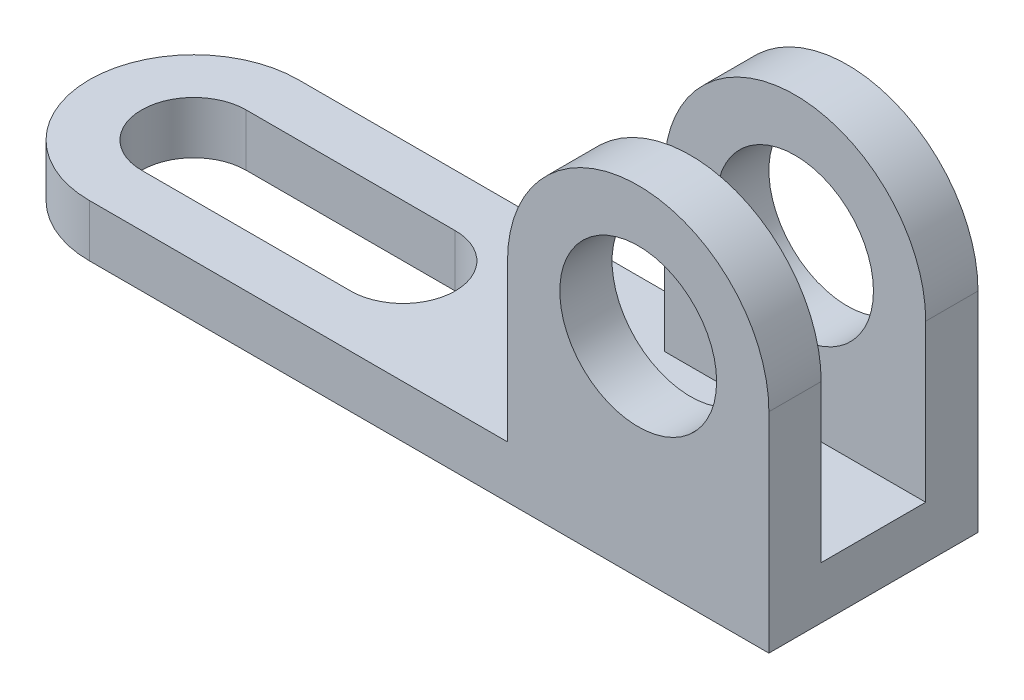
ISO-10303-21;
HEADER;
FILE_DESCRIPTION(('STEP AP214'),'2;1');
FILE_NAME('part.step','',(''),(''),'','','');
FILE_SCHEMA(('AUTOMOTIVE_DESIGN { 1 0 10303 214 1 1 1 1 }'));
ENDSEC;
DATA;
#1=APPLICATION_CONTEXT('core data for automotive mechanical design processes');
#2=APPLICATION_PROTOCOL_DEFINITION('international standard','automotive_design',2000,#1);
#3=PRODUCT_CONTEXT('',#1,'mechanical');
#4=PRODUCT('Part','Part','',(#3));
#5=PRODUCT_RELATED_PRODUCT_CATEGORY('part','',(#4));
#6=PRODUCT_DEFINITION_FORMATION('','',#4);
#7=PRODUCT_DEFINITION_CONTEXT('part definition',#1,'design');
#8=PRODUCT_DEFINITION('design','',#6,#7);
#9=PRODUCT_DEFINITION_SHAPE('','',#8);
#10=(LENGTH_UNIT() NAMED_UNIT(*) SI_UNIT(.MILLI.,.METRE.));
#11=(NAMED_UNIT(*) PLANE_ANGLE_UNIT() SI_UNIT($,.RADIAN.));
#12=(NAMED_UNIT(*) SI_UNIT($,.STERADIAN.) SOLID_ANGLE_UNIT());
#13=UNCERTAINTY_MEASURE_WITH_UNIT(LENGTH_MEASURE(1.E-05),#10,'distance_accuracy_value','');
#14=(GEOMETRIC_REPRESENTATION_CONTEXT(3) GLOBAL_UNCERTAINTY_ASSIGNED_CONTEXT((#13)) GLOBAL_UNIT_ASSIGNED_CONTEXT((#10,
#11,#12)) REPRESENTATION_CONTEXT('',''));
#15=CARTESIAN_POINT('',(0.,0.,0.));
#16=DIRECTION('',(0.,0.,1.));
#17=DIRECTION('',(1.,0.,0.));
#18=AXIS2_PLACEMENT_3D('',#15,#16,#17);
#19=CARTESIAN_POINT('',(-50.,80.,-20.));
#20=DIRECTION('',(1.,0.,0.));
#21=DIRECTION('',(0.,0.,-1.));
#22=AXIS2_PLACEMENT_3D('',#19,#20,#21);
#23=PLANE('',#22);
#24=DIRECTION('',(0.,0.,1.));
#25=VECTOR('',#24,1.);
#26=CARTESIAN_POINT('',(-50.,10.,-20.));
#27=LINE('',#26,#25);
#28=CARTESIAN_POINT('',(-50.,10.,-20.));
#29=VERTEX_POINT('',#28);
#30=CARTESIAN_POINT('',(-50.,9.99999999999999,-9.99999999999998));
#31=VERTEX_POINT('',#30);
#32=EDGE_CURVE('E222',#29,#31,#27,.T.);
#33=ORIENTED_EDGE('',*,*,#32,.T.);
#34=DIRECTION('',(0.,1.,0.));
#35=VECTOR('',#34,1.);
#36=CARTESIAN_POINT('',(-50.,80.,-9.99999999999998));
#37=LINE('',#36,#35);
#38=CARTESIAN_POINT('',(-50.,40.,-9.99999999999998));
#39=VERTEX_POINT('',#38);
#40=EDGE_CURVE('E198',#31,#39,#37,.T.);
#41=ORIENTED_EDGE('',*,*,#40,.T.);
#42=DIRECTION('',(0.,0.,1.));
#43=VECTOR('',#42,1.);
#44=CARTESIAN_POINT('',(-50.,40.,-20.));
#45=LINE('',#44,#43);
#46=CARTESIAN_POINT('',(-50.,40.,-20.));
#47=VERTEX_POINT('',#46);
#48=EDGE_CURVE('E219',#47,#39,#45,.T.);
#49=ORIENTED_EDGE('',*,*,#48,.F.);
#50=DIRECTION('',(0.,-1.,0.));
#51=VECTOR('',#50,1.);
#52=CARTESIAN_POINT('',(-50.,80.,-20.));
#53=LINE('',#52,#51);
#54=EDGE_CURVE('E228',#47,#29,#53,.T.);
#55=ORIENTED_EDGE('',*,*,#54,.T.);
#56=EDGE_LOOP('',(#33,#41,#49,#55));
#57=FACE_BOUND('',#56,.T.);
#58=ADVANCED_FACE('F37',(#57),#23,.F.);
#59=CARTESIAN_POINT('',(-25.,40.,-20.));
#60=DIRECTION('',(0.,0.,1.));
#61=DIRECTION('',(1.,0.,0.));
#62=AXIS2_PLACEMENT_3D('',#59,#60,#61);
#63=CYLINDRICAL_SURFACE('',#62,25.);
#64=ORIENTED_EDGE('',*,*,#48,.T.);
#65=CARTESIAN_POINT('',(-25.,40.,-9.99999999999999));
#66=DIRECTION('',(0.,0.,-1.));
#67=DIRECTION('',(-1.,0.,0.));
#68=AXIS2_PLACEMENT_3D('',#65,#66,#67);
#69=CIRCLE('',#68,25.);
#70=CARTESIAN_POINT('',(0.,40.,-10.));
#71=VERTEX_POINT('',#70);
#72=EDGE_CURVE('E195',#39,#71,#69,.T.);
#73=ORIENTED_EDGE('',*,*,#72,.T.);
#74=DIRECTION('',(0.,0.,1.));
#75=VECTOR('',#74,1.);
#76=CARTESIAN_POINT('',(0.,40.,-20.));
#77=LINE('',#76,#75);
#78=CARTESIAN_POINT('',(0.,40.,-20.));
#79=VERTEX_POINT('',#78);
#80=EDGE_CURVE('E214',#79,#71,#77,.T.);
#81=ORIENTED_EDGE('',*,*,#80,.F.);
#82=CARTESIAN_POINT('',(-25.,40.,-20.));
#83=DIRECTION('',(0.,0.,-1.));
#84=DIRECTION('',(-1.,0.,0.));
#85=AXIS2_PLACEMENT_3D('',#82,#83,#84);
#86=CIRCLE('',#85,25.);
#87=EDGE_CURVE('E208',#47,#79,#86,.T.);
#88=ORIENTED_EDGE('',*,*,#87,.F.);
#89=EDGE_LOOP('',(#64,#73,#81,#88));
#90=FACE_BOUND('',#89,.T.);
#91=ADVANCED_FACE('F288',(#90),#63,.T.);
#92=CARTESIAN_POINT('',(-25.,40.,-20.));
#93=DIRECTION('',(0.,0.,1.));
#94=DIRECTION('',(1.,0.,0.));
#95=AXIS2_PLACEMENT_3D('',#92,#93,#94);
#96=CYLINDRICAL_SURFACE('',#95,15.);
#97=CARTESIAN_POINT('',(-25.,40.,-9.99999999999999));
#98=DIRECTION('',(0.,0.,-1.));
#99=DIRECTION('',(-1.,0.,0.));
#100=AXIS2_PLACEMENT_3D('',#97,#98,#99);
#101=CIRCLE('',#100,15.);
#102=CARTESIAN_POINT('',(-40.,40.,-9.99999999999999));
#103=VERTEX_POINT('',#102);
#104=EDGE_CURVE('E41',#103,#103,#101,.F.);
#105=ORIENTED_EDGE('',*,*,#104,.T.);
#106=EDGE_LOOP('',(#105));
#107=FACE_BOUND('',#106,.T.);
#108=CARTESIAN_POINT('',(-25.,40.,-20.));
#109=DIRECTION('',(0.,0.,1.));
#110=DIRECTION('',(1.,0.,0.));
#111=AXIS2_PLACEMENT_3D('',#108,#109,#110);
#112=CIRCLE('',#111,15.);
#113=CARTESIAN_POINT('',(-10.,40.,-20.));
#114=VERTEX_POINT('',#113);
#115=EDGE_CURVE('E202',#114,#114,#112,.T.);
#116=ORIENTED_EDGE('',*,*,#115,.F.);
#117=EDGE_LOOP('',(#116));
#118=FACE_BOUND('',#117,.T.);
#119=ADVANCED_FACE('F316',(#107,#118),#96,.F.);
#120=CARTESIAN_POINT('',(0.,10.,-20.));
#121=DIRECTION('',(-1.,0.,0.));
#122=DIRECTION('',(0.,0.,1.));
#123=AXIS2_PLACEMENT_3D('',#120,#121,#122);
#124=PLANE('',#123);
#125=ORIENTED_EDGE('',*,*,#80,.T.);
#126=DIRECTION('',(0.,1.,0.));
#127=VECTOR('',#126,1.);
#128=CARTESIAN_POINT('',(0.,80.,-10.));
#129=LINE('',#128,#127);
#130=CARTESIAN_POINT('',(0.,9.99999999999999,-10.));
#131=VERTEX_POINT('',#130);
#132=EDGE_CURVE('E173',#131,#71,#129,.T.);
#133=ORIENTED_EDGE('',*,*,#132,.F.);
#134=DIRECTION('',(0.,0.,-1.));
#135=VECTOR('',#134,1.);
#136=CARTESIAN_POINT('',(0.,10.,10.));
#137=LINE('',#136,#135);
#138=CARTESIAN_POINT('',(0.,10.,10.));
#139=VERTEX_POINT('',#138);
#140=EDGE_CURVE('E181',#139,#131,#137,.T.);
#141=ORIENTED_EDGE('',*,*,#140,.F.);
#142=DIRECTION('',(0.,-1.,0.));
#143=VECTOR('',#142,1.);
#144=CARTESIAN_POINT('',(0.,80.,10.));
#145=LINE('',#144,#143);
#146=CARTESIAN_POINT('',(0.,40.,10.));
#147=VERTEX_POINT('',#146);
#148=EDGE_CURVE('E178',#147,#139,#145,.T.);
#149=ORIENTED_EDGE('',*,*,#148,.F.);
#150=CARTESIAN_POINT('',(0.,40.,20.));
#151=VERTEX_POINT('',#150);
#152=EDGE_CURVE('E218',#147,#151,#77,.T.);
#153=ORIENTED_EDGE('',*,*,#152,.T.);
#154=DIRECTION('',(0.,-1.,0.));
#155=VECTOR('',#154,1.);
#156=CARTESIAN_POINT('',(0.,10.,20.));
#157=LINE('',#156,#155);
#158=CARTESIAN_POINT('',(0.,0.,20.));
#159=VERTEX_POINT('',#158);
#160=EDGE_CURVE('E250',#151,#159,#157,.T.);
#161=ORIENTED_EDGE('',*,*,#160,.T.);
#162=DIRECTION('',(0.,0.,-1.));
#163=VECTOR('',#162,1.);
#164=CARTESIAN_POINT('',(0.,0.,-20.));
#165=LINE('',#164,#163);
#166=CARTESIAN_POINT('',(0.,0.,-20.));
#167=VERTEX_POINT('',#166);
#168=EDGE_CURVE('E234',#159,#167,#165,.T.);
#169=ORIENTED_EDGE('',*,*,#168,.T.);
#170=DIRECTION('',(0.,-1.,0.));
#171=VECTOR('',#170,1.);
#172=CARTESIAN_POINT('',(0.,10.,-20.));
#173=LINE('',#172,#171);
#174=EDGE_CURVE('E239',#79,#167,#173,.T.);
#175=ORIENTED_EDGE('',*,*,#174,.F.);
#176=EDGE_LOOP('',(#125,#133,#141,#149,#153,#161,#169,#175));
#177=FACE_BOUND('',#176,.T.);
#178=ADVANCED_FACE('F270',(#177),#124,.F.);
#179=CARTESIAN_POINT('',(-130.,10.,-20.));
#180=DIRECTION('',(0.,0.,1.));
#181=DIRECTION('',(1.,0.,0.));
#182=AXIS2_PLACEMENT_3D('',#179,#180,#181);
#183=PLANE('',#182);
#184=ORIENTED_EDGE('',*,*,#115,.T.);
#185=EDGE_LOOP('',(#184));
#186=FACE_BOUND('',#185,.T.);
#187=ORIENTED_EDGE('',*,*,#54,.F.);
#188=ORIENTED_EDGE('',*,*,#87,.T.);
#189=ORIENTED_EDGE('',*,*,#174,.T.);
#190=DIRECTION('',(-1.,0.,0.));
#191=VECTOR('',#190,1.);
#192=CARTESIAN_POINT('',(-130.,0.,-20.));
#193=LINE('',#192,#191);
#194=CARTESIAN_POINT('',(-130.,0.,-20.));
#195=VERTEX_POINT('',#194);
#196=EDGE_CURVE('E230',#167,#195,#193,.T.);
#197=ORIENTED_EDGE('',*,*,#196,.T.);
#198=DIRECTION('',(0.,-1.,0.));
#199=VECTOR('',#198,1.);
#200=CARTESIAN_POINT('',(-130.,10.,-20.));
#201=LINE('',#200,#199);
#202=CARTESIAN_POINT('',(-130.,10.,-20.));
#203=VERTEX_POINT('',#202);
#204=EDGE_CURVE('E11',#203,#195,#201,.T.);
#205=ORIENTED_EDGE('',*,*,#204,.F.);
#206=DIRECTION('',(-1.,0.,0.));
#207=VECTOR('',#206,1.);
#208=CARTESIAN_POINT('',(-130.,10.,-20.));
#209=LINE('',#208,#207);
#210=EDGE_CURVE('E231',#29,#203,#209,.T.);
#211=ORIENTED_EDGE('',*,*,#210,.F.);
#212=EDGE_LOOP('',(#187,#188,#189,#197,#205,#211));
#213=FACE_BOUND('',#212,.T.);
#214=ADVANCED_FACE('F39',(#186,#213),#183,.F.);
#215=CARTESIAN_POINT('',(-130.,10.,0.));
#216=DIRECTION('',(0.,-1.,0.));
#217=DIRECTION('',(0.,0.,-1.));
#218=AXIS2_PLACEMENT_3D('',#215,#216,#217);
#219=CYLINDRICAL_SURFACE('',#218,20.);
#220=CARTESIAN_POINT('',(-130.,0.,0.));
#221=DIRECTION('',(0.,1.,0.));
#222=DIRECTION('',(0.,0.,1.));
#223=AXIS2_PLACEMENT_3D('',#220,#221,#222);
#224=CIRCLE('',#223,20.);
#225=CARTESIAN_POINT('',(-130.,0.,20.0000000000001));
#226=VERTEX_POINT('',#225);
#227=EDGE_CURVE('E242',#195,#226,#224,.T.);
#228=ORIENTED_EDGE('',*,*,#227,.T.);
#229=DIRECTION('',(0.,-1.,0.));
#230=VECTOR('',#229,1.);
#231=CARTESIAN_POINT('',(-130.,10.,20.0000000000001));
#232=LINE('',#231,#230);
#233=CARTESIAN_POINT('',(-130.,10.,20.0000000000001));
#234=VERTEX_POINT('',#233);
#235=EDGE_CURVE('E46',#234,#226,#232,.T.);
#236=ORIENTED_EDGE('',*,*,#235,.F.);
#237=CARTESIAN_POINT('',(-130.,10.,0.));
#238=DIRECTION('',(0.,1.,0.));
#239=DIRECTION('',(0.,0.,1.));
#240=AXIS2_PLACEMENT_3D('',#237,#238,#239);
#241=CIRCLE('',#240,20.);
#242=EDGE_CURVE('E233',#203,#234,#241,.T.);
#243=ORIENTED_EDGE('',*,*,#242,.F.);
#244=ORIENTED_EDGE('',*,*,#204,.T.);
#245=EDGE_LOOP('',(#228,#236,#243,#244));
#246=FACE_BOUND('',#245,.T.);
#247=ADVANCED_FACE('F302',(#246),#219,.T.);
#248=CARTESIAN_POINT('',(0.,10.,20.));
#249=DIRECTION('',(0.,0.,-1.));
#250=DIRECTION('',(-1.,0.,0.));
#251=AXIS2_PLACEMENT_3D('',#248,#249,#250);
#252=PLANE('',#251);
#253=CARTESIAN_POINT('',(-25.,40.,20.));
#254=DIRECTION('',(0.,0.,1.));
#255=DIRECTION('',(1.,0.,0.));
#256=AXIS2_PLACEMENT_3D('',#253,#254,#255);
#257=CIRCLE('',#256,15.);
#258=CARTESIAN_POINT('',(-10.,40.,20.));
#259=VERTEX_POINT('',#258);
#260=EDGE_CURVE('E201',#259,#259,#257,.T.);
#261=ORIENTED_EDGE('',*,*,#260,.F.);
#262=EDGE_LOOP('',(#261));
#263=FACE_BOUND('',#262,.T.);
#264=ORIENTED_EDGE('',*,*,#160,.F.);
#265=CARTESIAN_POINT('',(-25.,40.,20.));
#266=DIRECTION('',(0.,0.,-1.));
#267=DIRECTION('',(-1.,0.,0.));
#268=AXIS2_PLACEMENT_3D('',#265,#266,#267);
#269=CIRCLE('',#268,25.);
#270=CARTESIAN_POINT('',(-50.,40.,20.));
#271=VERTEX_POINT('',#270);
#272=EDGE_CURVE('E205',#271,#151,#269,.T.);
#273=ORIENTED_EDGE('',*,*,#272,.F.);
#274=DIRECTION('',(0.,-1.,0.));
#275=VECTOR('',#274,1.);
#276=CARTESIAN_POINT('',(-50.,80.,20.0000000000001));
#277=LINE('',#276,#275);
#278=CARTESIAN_POINT('',(-50.,10.,20.0000000000001));
#279=VERTEX_POINT('',#278);
#280=EDGE_CURVE('E225',#271,#279,#277,.T.);
#281=ORIENTED_EDGE('',*,*,#280,.T.);
#282=DIRECTION('',(1.,0.,0.));
#283=VECTOR('',#282,1.);
#284=CARTESIAN_POINT('',(0.,10.,20.));
#285=LINE('',#284,#283);
#286=EDGE_CURVE('E236',#234,#279,#285,.T.);
#287=ORIENTED_EDGE('',*,*,#286,.F.);
#288=ORIENTED_EDGE('',*,*,#235,.T.);
#289=DIRECTION('',(1.,0.,0.));
#290=VECTOR('',#289,1.);
#291=CARTESIAN_POINT('',(0.,0.,20.));
#292=LINE('',#291,#290);
#293=EDGE_CURVE('E244',#226,#159,#292,.T.);
#294=ORIENTED_EDGE('',*,*,#293,.T.);
#295=EDGE_LOOP('',(#264,#273,#281,#287,#288,#294));
#296=FACE_BOUND('',#295,.T.);
#297=ADVANCED_FACE('F277',(#263,#296),#252,.F.);
#298=CARTESIAN_POINT('',(-130.,10.,0.));
#299=DIRECTION('',(0.,1.,0.));
#300=DIRECTION('',(0.,0.,1.));
#301=AXIS2_PLACEMENT_3D('',#298,#299,#300);
#302=PLANE('',#301);
#303=CARTESIAN_POINT('',(-130.,10.,0.));
#304=DIRECTION('',(0.,1.,0.));
#305=DIRECTION('',(0.,0.,1.));
#306=AXIS2_PLACEMENT_3D('',#303,#304,#305);
#307=CIRCLE('',#306,10.);
#308=CARTESIAN_POINT('',(-130.,10.,-10.));
#309=VERTEX_POINT('',#308);
#310=CARTESIAN_POINT('',(-130.,10.,10.));
#311=VERTEX_POINT('',#310);
#312=EDGE_CURVE('E54',#309,#311,#307,.T.);
#313=ORIENTED_EDGE('',*,*,#312,.F.);
#314=DIRECTION('',(-1.,0.,0.));
#315=VECTOR('',#314,1.);
#316=CARTESIAN_POINT('',(-130.,10.,-10.));
#317=LINE('',#316,#315);
#318=CARTESIAN_POINT('',(-90.,10.,-10.));
#319=VERTEX_POINT('',#318);
#320=EDGE_CURVE('E158',#319,#309,#317,.T.);
#321=ORIENTED_EDGE('',*,*,#320,.F.);
#322=CARTESIAN_POINT('',(-90.,10.,0.));
#323=DIRECTION('',(0.,1.,0.));
#324=DIRECTION('',(0.,0.,1.));
#325=AXIS2_PLACEMENT_3D('',#322,#323,#324);
#326=CIRCLE('',#325,10.);
#327=CARTESIAN_POINT('',(-90.,10.,10.));
#328=VERTEX_POINT('',#327);
#329=EDGE_CURVE('E161',#328,#319,#326,.T.);
#330=ORIENTED_EDGE('',*,*,#329,.F.);
#331=DIRECTION('',(1.,0.,0.));
#332=VECTOR('',#331,1.);
#333=CARTESIAN_POINT('',(-130.,10.,10.));
#334=LINE('',#333,#332);
#335=EDGE_CURVE('E167',#311,#328,#334,.T.);
#336=ORIENTED_EDGE('',*,*,#335,.F.);
#337=EDGE_LOOP('',(#313,#321,#330,#336));
#338=FACE_BOUND('',#337,.T.);
#339=CARTESIAN_POINT('',(-50.,10.,10.));
#340=VERTEX_POINT('',#339);
#341=EDGE_CURVE('E217',#340,#279,#27,.T.);
#342=ORIENTED_EDGE('',*,*,#341,.F.);
#343=DIRECTION('',(1.,0.,0.));
#344=VECTOR('',#343,1.);
#345=CARTESIAN_POINT('',(-150.,10.,10.));
#346=LINE('',#345,#344);
#347=EDGE_CURVE('E184',#340,#139,#346,.T.);
#348=ORIENTED_EDGE('',*,*,#347,.T.);
#349=ORIENTED_EDGE('',*,*,#140,.T.);
#350=DIRECTION('',(1.,0.,0.));
#351=VECTOR('',#350,1.);
#352=CARTESIAN_POINT('',(-150.,9.99999999999999,-9.99999999999995));
#353=LINE('',#352,#351);
#354=EDGE_CURVE('E185',#31,#131,#353,.T.);
#355=ORIENTED_EDGE('',*,*,#354,.F.);
#356=ORIENTED_EDGE('',*,*,#32,.F.);
#357=ORIENTED_EDGE('',*,*,#210,.T.);
#358=ORIENTED_EDGE('',*,*,#242,.T.);
#359=ORIENTED_EDGE('',*,*,#286,.T.);
#360=EDGE_LOOP('',(#342,#348,#349,#355,#356,#357,#358,#359));
#361=FACE_BOUND('',#360,.T.);
#362=ADVANCED_FACE('F295',(#338,#361),#302,.T.);
#363=CARTESIAN_POINT('',(-130.,0.,0.));
#364=DIRECTION('',(0.,1.,0.));
#365=DIRECTION('',(0.,0.,1.));
#366=AXIS2_PLACEMENT_3D('',#363,#364,#365);
#367=PLANE('',#366);
#368=DIRECTION('',(-1.,0.,0.));
#369=VECTOR('',#368,1.);
#370=CARTESIAN_POINT('',(-130.,0.,-10.));
#371=LINE('',#370,#369);
#372=CARTESIAN_POINT('',(-90.,0.,-10.));
#373=VERTEX_POINT('',#372);
#374=CARTESIAN_POINT('',(-130.,0.,-10.));
#375=VERTEX_POINT('',#374);
#376=EDGE_CURVE('E148',#373,#375,#371,.T.);
#377=ORIENTED_EDGE('',*,*,#376,.T.);
#378=CARTESIAN_POINT('',(-130.,0.,0.));
#379=DIRECTION('',(0.,1.,0.));
#380=DIRECTION('',(0.,0.,1.));
#381=AXIS2_PLACEMENT_3D('',#378,#379,#380);
#382=CIRCLE('',#381,10.);
#383=CARTESIAN_POINT('',(-130.,0.,10.));
#384=VERTEX_POINT('',#383);
#385=EDGE_CURVE('E142',#375,#384,#382,.T.);
#386=ORIENTED_EDGE('',*,*,#385,.T.);
#387=DIRECTION('',(1.,0.,0.));
#388=VECTOR('',#387,1.);
#389=CARTESIAN_POINT('',(-130.,0.,10.));
#390=LINE('',#389,#388);
#391=CARTESIAN_POINT('',(-90.,0.,10.));
#392=VERTEX_POINT('',#391);
#393=EDGE_CURVE('E151',#384,#392,#390,.T.);
#394=ORIENTED_EDGE('',*,*,#393,.T.);
#395=CARTESIAN_POINT('',(-90.,0.,0.));
#396=DIRECTION('',(0.,1.,0.));
#397=DIRECTION('',(0.,0.,1.));
#398=AXIS2_PLACEMENT_3D('',#395,#396,#397);
#399=CIRCLE('',#398,10.);
#400=EDGE_CURVE('E62',#392,#373,#399,.T.);
#401=ORIENTED_EDGE('',*,*,#400,.T.);
#402=EDGE_LOOP('',(#377,#386,#394,#401));
#403=FACE_BOUND('',#402,.T.);
#404=ORIENTED_EDGE('',*,*,#196,.F.);
#405=ORIENTED_EDGE('',*,*,#168,.F.);
#406=ORIENTED_EDGE('',*,*,#293,.F.);
#407=ORIENTED_EDGE('',*,*,#227,.F.);
#408=EDGE_LOOP('',(#404,#405,#406,#407));
#409=FACE_BOUND('',#408,.T.);
#410=ADVANCED_FACE('F155',(#403,#409),#367,.F.);
#411=CARTESIAN_POINT('',(-50.,40.,10.));
#412=VERTEX_POINT('',#411);
#413=EDGE_CURVE('E211',#412,#271,#45,.T.);
#414=ORIENTED_EDGE('',*,*,#413,.F.);
#415=DIRECTION('',(0.,-1.,0.));
#416=VECTOR('',#415,1.);
#417=CARTESIAN_POINT('',(-50.,80.,10.));
#418=LINE('',#417,#416);
#419=EDGE_CURVE('E192',#412,#340,#418,.T.);
#420=ORIENTED_EDGE('',*,*,#419,.T.);
#421=ORIENTED_EDGE('',*,*,#341,.T.);
#422=ORIENTED_EDGE('',*,*,#280,.F.);
#423=EDGE_LOOP('',(#414,#420,#421,#422));
#424=FACE_BOUND('',#423,.T.);
#425=ADVANCED_FACE('F297',(#424),#23,.F.);
#426=ORIENTED_EDGE('',*,*,#152,.F.);
#427=CARTESIAN_POINT('',(-25.,40.,10.));
#428=DIRECTION('',(0.,0.,1.));
#429=DIRECTION('',(1.,0.,0.));
#430=AXIS2_PLACEMENT_3D('',#427,#428,#429);
#431=CIRCLE('',#430,25.);
#432=EDGE_CURVE('E189',#147,#412,#431,.T.);
#433=ORIENTED_EDGE('',*,*,#432,.T.);
#434=ORIENTED_EDGE('',*,*,#413,.T.);
#435=ORIENTED_EDGE('',*,*,#272,.T.);
#436=EDGE_LOOP('',(#426,#433,#434,#435));
#437=FACE_BOUND('',#436,.T.);
#438=ADVANCED_FACE('F272',(#437),#63,.T.);
#439=CARTESIAN_POINT('',(-25.,40.,10.));
#440=DIRECTION('',(0.,0.,1.));
#441=DIRECTION('',(1.,0.,0.));
#442=AXIS2_PLACEMENT_3D('',#439,#440,#441);
#443=CIRCLE('',#442,15.);
#444=CARTESIAN_POINT('',(-10.,40.,10.));
#445=VERTEX_POINT('',#444);
#446=EDGE_CURVE('E187',#445,#445,#443,.F.);
#447=ORIENTED_EDGE('',*,*,#446,.T.);
#448=EDGE_LOOP('',(#447));
#449=FACE_BOUND('',#448,.T.);
#450=ORIENTED_EDGE('',*,*,#260,.T.);
#451=EDGE_LOOP('',(#450));
#452=FACE_BOUND('',#451,.T.);
#453=ADVANCED_FACE('F256',(#449,#452),#96,.F.);
#454=CARTESIAN_POINT('',(-150.,80.,-9.99999999999995));
#455=DIRECTION('',(0.,0.,-1.));
#456=DIRECTION('',(-1.,0.,0.));
#457=AXIS2_PLACEMENT_3D('',#454,#455,#456);
#458=PLANE('',#457);
#459=ORIENTED_EDGE('',*,*,#104,.F.);
#460=EDGE_LOOP('',(#459));
#461=FACE_BOUND('',#460,.T.);
#462=ORIENTED_EDGE('',*,*,#354,.T.);
#463=ORIENTED_EDGE('',*,*,#132,.T.);
#464=ORIENTED_EDGE('',*,*,#72,.F.);
#465=ORIENTED_EDGE('',*,*,#40,.F.);
#466=EDGE_LOOP('',(#462,#463,#464,#465));
#467=FACE_BOUND('',#466,.T.);
#468=ADVANCED_FACE('F262',(#461,#467),#458,.F.);
#469=CARTESIAN_POINT('',(-150.,80.,10.));
#470=DIRECTION('',(0.,0.,1.));
#471=DIRECTION('',(1.,0.,0.));
#472=AXIS2_PLACEMENT_3D('',#469,#470,#471);
#473=PLANE('',#472);
#474=ORIENTED_EDGE('',*,*,#446,.F.);
#475=EDGE_LOOP('',(#474));
#476=FACE_BOUND('',#475,.T.);
#477=ORIENTED_EDGE('',*,*,#432,.F.);
#478=ORIENTED_EDGE('',*,*,#148,.T.);
#479=ORIENTED_EDGE('',*,*,#347,.F.);
#480=ORIENTED_EDGE('',*,*,#419,.F.);
#481=EDGE_LOOP('',(#477,#478,#479,#480));
#482=FACE_BOUND('',#481,.T.);
#483=ADVANCED_FACE('F259',(#476,#482),#473,.F.);
#484=CARTESIAN_POINT('',(-130.,0.,0.));
#485=DIRECTION('',(0.,1.,0.));
#486=DIRECTION('',(0.,0.,1.));
#487=AXIS2_PLACEMENT_3D('',#484,#485,#486);
#488=CYLINDRICAL_SURFACE('',#487,10.);
#489=ORIENTED_EDGE('',*,*,#312,.T.);
#490=DIRECTION('',(0.,1.,0.));
#491=VECTOR('',#490,1.);
#492=CARTESIAN_POINT('',(-130.,0.,10.));
#493=LINE('',#492,#491);
#494=EDGE_CURVE('E138',#384,#311,#493,.T.);
#495=ORIENTED_EDGE('',*,*,#494,.F.);
#496=ORIENTED_EDGE('',*,*,#385,.F.);
#497=DIRECTION('',(0.,1.,0.));
#498=VECTOR('',#497,1.);
#499=CARTESIAN_POINT('',(-130.,0.,-10.));
#500=LINE('',#499,#498);
#501=EDGE_CURVE('E171',#375,#309,#500,.T.);
#502=ORIENTED_EDGE('',*,*,#501,.T.);
#503=EDGE_LOOP('',(#489,#495,#496,#502));
#504=FACE_BOUND('',#503,.T.);
#505=ADVANCED_FACE('F140',(#504),#488,.F.);
#506=CARTESIAN_POINT('',(-130.,0.,-10.));
#507=DIRECTION('',(0.,0.,-1.));
#508=DIRECTION('',(-1.,0.,0.));
#509=AXIS2_PLACEMENT_3D('',#506,#507,#508);
#510=PLANE('',#509);
#511=ORIENTED_EDGE('',*,*,#320,.T.);
#512=ORIENTED_EDGE('',*,*,#501,.F.);
#513=ORIENTED_EDGE('',*,*,#376,.F.);
#514=DIRECTION('',(0.,1.,0.));
#515=VECTOR('',#514,1.);
#516=CARTESIAN_POINT('',(-90.,0.,-10.));
#517=LINE('',#516,#515);
#518=EDGE_CURVE('E174',#373,#319,#517,.T.);
#519=ORIENTED_EDGE('',*,*,#518,.T.);
#520=EDGE_LOOP('',(#511,#512,#513,#519));
#521=FACE_BOUND('',#520,.T.);
#522=ADVANCED_FACE('F352',(#521),#510,.F.);
#523=CARTESIAN_POINT('',(-90.,0.,0.));
#524=DIRECTION('',(0.,1.,0.));
#525=DIRECTION('',(0.,0.,1.));
#526=AXIS2_PLACEMENT_3D('',#523,#524,#525);
#527=CYLINDRICAL_SURFACE('',#526,10.);
#528=ORIENTED_EDGE('',*,*,#329,.T.);
#529=ORIENTED_EDGE('',*,*,#518,.F.);
#530=ORIENTED_EDGE('',*,*,#400,.F.);
#531=DIRECTION('',(0.,1.,0.));
#532=VECTOR('',#531,1.);
#533=CARTESIAN_POINT('',(-90.,0.,10.));
#534=LINE('',#533,#532);
#535=EDGE_CURVE('E147',#392,#328,#534,.T.);
#536=ORIENTED_EDGE('',*,*,#535,.T.);
#537=EDGE_LOOP('',(#528,#529,#530,#536));
#538=FACE_BOUND('',#537,.T.);
#539=ADVANCED_FACE('F355',(#538),#527,.F.);
#540=CARTESIAN_POINT('',(-130.,0.,10.));
#541=DIRECTION('',(0.,0.,1.));
#542=DIRECTION('',(1.,0.,0.));
#543=AXIS2_PLACEMENT_3D('',#540,#541,#542);
#544=PLANE('',#543);
#545=ORIENTED_EDGE('',*,*,#335,.T.);
#546=ORIENTED_EDGE('',*,*,#535,.F.);
#547=ORIENTED_EDGE('',*,*,#393,.F.);
#548=ORIENTED_EDGE('',*,*,#494,.T.);
#549=EDGE_LOOP('',(#545,#546,#547,#548));
#550=FACE_BOUND('',#549,.T.);
#551=ADVANCED_FACE('F152',(#550),#544,.F.);
#552=CLOSED_SHELL('',(#58,#91,#119,#178,#214,#247,#297,#362,#410,#425,#438,#453,#468,#483,#505,
#522,#539,#551));
#553=MANIFOLD_SOLID_BREP('B2',#552);
#554=ADVANCED_BREP_SHAPE_REPRESENTATION('',(#18,#553),#14);
#555=SHAPE_DEFINITION_REPRESENTATION(#9,#554);
ENDSEC;
END-ISO-10303-21;
